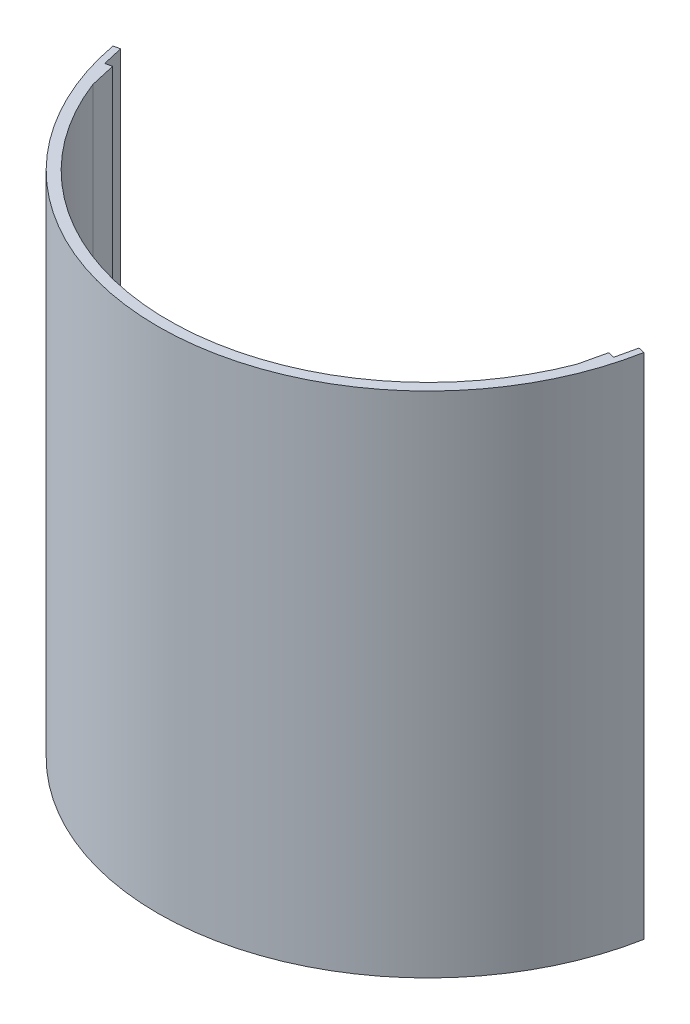
ISO-10303-21;
HEADER;
FILE_DESCRIPTION(('STEP AP214'),'2;1');
FILE_NAME('part.step','',(''),(''),'','','');
FILE_SCHEMA(('AUTOMOTIVE_DESIGN { 1 0 10303 214 1 1 1 1 }'));
ENDSEC;
DATA;
#1=APPLICATION_CONTEXT('core data for automotive mechanical design processes');
#2=APPLICATION_PROTOCOL_DEFINITION('international standard','automotive_design',2000,#1);
#3=PRODUCT_CONTEXT('',#1,'mechanical');
#4=PRODUCT('Part','Part','',(#3));
#5=PRODUCT_RELATED_PRODUCT_CATEGORY('part','',(#4));
#6=PRODUCT_DEFINITION_FORMATION('','',#4);
#7=PRODUCT_DEFINITION_CONTEXT('part definition',#1,'design');
#8=PRODUCT_DEFINITION('design','',#6,#7);
#9=PRODUCT_DEFINITION_SHAPE('','',#8);
#10=(LENGTH_UNIT() NAMED_UNIT(*) SI_UNIT(.MILLI.,.METRE.));
#11=(NAMED_UNIT(*) PLANE_ANGLE_UNIT() SI_UNIT($,.RADIAN.));
#12=(NAMED_UNIT(*) SI_UNIT($,.STERADIAN.) SOLID_ANGLE_UNIT());
#13=UNCERTAINTY_MEASURE_WITH_UNIT(LENGTH_MEASURE(1.E-05),#10,'distance_accuracy_value','');
#14=(GEOMETRIC_REPRESENTATION_CONTEXT(3) GLOBAL_UNCERTAINTY_ASSIGNED_CONTEXT((#13)) GLOBAL_UNIT_ASSIGNED_CONTEXT((#10,
#11,#12)) REPRESENTATION_CONTEXT('',''));
#15=CARTESIAN_POINT('',(0.,0.,0.));
#16=DIRECTION('',(0.,0.,1.));
#17=DIRECTION('',(1.,0.,0.));
#18=AXIS2_PLACEMENT_3D('',#15,#16,#17);
#19=CARTESIAN_POINT('',(-46.8430902791342,204.663469235024,12.7269357309953));
#20=DIRECTION('',(-0.975000000000001,0.,0.222204860432888));
#21=DIRECTION('',(0.222204860432888,0.,0.975000000000001));
#22=AXIS2_PLACEMENT_3D('',#19,#20,#21);
#23=PLANE('',#22);
#24=DIRECTION('',(-0.222204860432888,0.,-0.975000000000001));
#25=VECTOR('',#24,1.);
#26=CARTESIAN_POINT('',(-46.8430902791342,96.,12.7269357309953));
#27=LINE('',#26,#25);
#28=CARTESIAN_POINT('',(-45.7360389950115,96.,17.5845027523325));
#29=VERTEX_POINT('',#28);
#30=CARTESIAN_POINT('',(-46.8430902791342,96.,12.7269357309953));
#31=VERTEX_POINT('',#30);
#32=EDGE_CURVE('E169',#29,#31,#27,.T.);
#33=ORIENTED_EDGE('',*,*,#32,.F.);
#34=DIRECTION('',(0.,-1.,0.));
#35=VECTOR('',#34,1.);
#36=CARTESIAN_POINT('',(-45.7360389950115,204.663469235024,17.5845027523325));
#37=LINE('',#36,#35);
#38=CARTESIAN_POINT('',(-45.7360389950115,0.,17.5845027523325));
#39=VERTEX_POINT('',#38);
#40=EDGE_CURVE('E47',#29,#39,#37,.T.);
#41=ORIENTED_EDGE('',*,*,#40,.T.);
#42=DIRECTION('',(-0.222204860432888,0.,-0.975));
#43=VECTOR('',#42,1.);
#44=CARTESIAN_POINT('',(-46.8430902791342,0.,12.7269357309953));
#45=LINE('',#44,#43);
#46=CARTESIAN_POINT('',(-46.8430902791342,0.,12.7269357309953));
#47=VERTEX_POINT('',#46);
#48=EDGE_CURVE('E180',#39,#47,#45,.T.);
#49=ORIENTED_EDGE('',*,*,#48,.T.);
#50=DIRECTION('',(0.,-1.,0.));
#51=VECTOR('',#50,1.);
#52=CARTESIAN_POINT('',(-46.8430902791342,204.663469235024,12.7269357309953));
#53=LINE('',#52,#51);
#54=EDGE_CURVE('E107',#31,#47,#53,.T.);
#55=ORIENTED_EDGE('',*,*,#54,.F.);
#56=EDGE_LOOP('',(#33,#41,#49,#55));
#57=FACE_BOUND('',#56,.T.);
#58=ADVANCED_FACE('F43',(#57),#23,.F.);
#59=CARTESIAN_POINT('',(-46.8430902791342,204.663469235024,12.7269357309953));
#60=DIRECTION('',(0.222204860432887,0.,0.975000000000001));
#61=DIRECTION('',(0.975000000000001,0.,-0.222204860432887));
#62=AXIS2_PLACEMENT_3D('',#59,#60,#61);
#63=PLANE('',#62);
#64=DIRECTION('',(-0.975000000000001,0.,0.222204860432887));
#65=VECTOR('',#64,1.);
#66=CARTESIAN_POINT('',(-46.8430902791342,96.,12.7269357309953));
#67=LINE('',#66,#65);
#68=CARTESIAN_POINT('',(-48.0618402791341,96.,13.0046918065364));
#69=VERTEX_POINT('',#68);
#70=EDGE_CURVE('E114',#31,#69,#67,.T.);
#71=ORIENTED_EDGE('',*,*,#70,.F.);
#72=ORIENTED_EDGE('',*,*,#54,.T.);
#73=DIRECTION('',(-0.975,0.,0.222204860432887));
#74=VECTOR('',#73,1.);
#75=CARTESIAN_POINT('',(-46.8430902791342,0.,12.7269357309953));
#76=LINE('',#75,#74);
#77=CARTESIAN_POINT('',(-48.0618402791341,0.,13.0046918065364));
#78=VERTEX_POINT('',#77);
#79=EDGE_CURVE('E179',#47,#78,#76,.T.);
#80=ORIENTED_EDGE('',*,*,#79,.T.);
#81=DIRECTION('',(0.,-1.,0.));
#82=VECTOR('',#81,1.);
#83=CARTESIAN_POINT('',(-48.0618402791341,204.663469235024,13.0046918065364));
#84=LINE('',#83,#82);
#85=EDGE_CURVE('E181',#69,#78,#84,.T.);
#86=ORIENTED_EDGE('',*,*,#85,.F.);
#87=EDGE_LOOP('',(#71,#72,#80,#86));
#88=FACE_BOUND('',#87,.T.);
#89=ADVANCED_FACE('F238',(#88),#63,.F.);
#90=CARTESIAN_POINT('',(-48.0618402791341,204.663469235024,13.0046918065364));
#91=DIRECTION('',(-0.974999999999997,0.,0.222204860432904));
#92=DIRECTION('',(0.222204860432904,0.,0.974999999999997));
#93=AXIS2_PLACEMENT_3D('',#90,#91,#92);
#94=PLANE('',#93);
#95=DIRECTION('',(-0.222204860432904,0.,-0.974999999999997));
#96=VECTOR('',#95,1.);
#97=CARTESIAN_POINT('',(-48.0618402791341,96.,13.0046918065364));
#98=LINE('',#97,#96);
#99=CARTESIAN_POINT('',(-48.9506597208657,96.,9.10469180653663));
#100=VERTEX_POINT('',#99);
#101=EDGE_CURVE('E163',#69,#100,#98,.T.);
#102=ORIENTED_EDGE('',*,*,#101,.F.);
#103=ORIENTED_EDGE('',*,*,#85,.T.);
#104=DIRECTION('',(-0.222204860432904,0.,-0.974999999999997));
#105=VECTOR('',#104,1.);
#106=CARTESIAN_POINT('',(-48.0618402791341,0.,13.0046918065364));
#107=LINE('',#106,#105);
#108=CARTESIAN_POINT('',(-48.9506597208657,0.,9.10469180653663));
#109=VERTEX_POINT('',#108);
#110=EDGE_CURVE('E184',#78,#109,#107,.T.);
#111=ORIENTED_EDGE('',*,*,#110,.T.);
#112=DIRECTION('',(0.,-1.,0.));
#113=VECTOR('',#112,1.);
#114=CARTESIAN_POINT('',(-48.9506597208657,204.663469235024,9.10469180653663));
#115=LINE('',#114,#113);
#116=EDGE_CURVE('E185',#100,#109,#115,.T.);
#117=ORIENTED_EDGE('',*,*,#116,.F.);
#118=EDGE_LOOP('',(#102,#103,#111,#117));
#119=FACE_BOUND('',#118,.T.);
#120=ADVANCED_FACE('F241',(#119),#94,.F.);
#121=CARTESIAN_POINT('',(-48.9506597208657,204.663469235024,9.10469180653663));
#122=DIRECTION('',(0.22220486043289,0.,0.975));
#123=DIRECTION('',(0.975,0.,-0.22220486043289));
#124=AXIS2_PLACEMENT_3D('',#121,#122,#123);
#125=PLANE('',#124);
#126=DIRECTION('',(-0.975,0.,0.22220486043289));
#127=VECTOR('',#126,1.);
#128=CARTESIAN_POINT('',(-48.9506597208657,96.,9.10469180653663));
#129=LINE('',#128,#127);
#130=CARTESIAN_POINT('',(-50.1311597152052,96.,9.37373061318611));
#131=VERTEX_POINT('',#130);
#132=EDGE_CURVE('E159',#100,#131,#129,.T.);
#133=ORIENTED_EDGE('',*,*,#132,.F.);
#134=ORIENTED_EDGE('',*,*,#116,.T.);
#135=DIRECTION('',(-0.975,0.,0.22220486043289));
#136=VECTOR('',#135,1.);
#137=CARTESIAN_POINT('',(-48.9506597208657,0.,9.10469180653663));
#138=LINE('',#137,#136);
#139=CARTESIAN_POINT('',(-50.1311597152052,0.,9.37373061318611));
#140=VERTEX_POINT('',#139);
#141=EDGE_CURVE('E188',#109,#140,#138,.T.);
#142=ORIENTED_EDGE('',*,*,#141,.T.);
#143=DIRECTION('',(0.,-1.,0.));
#144=VECTOR('',#143,1.);
#145=CARTESIAN_POINT('',(-50.1311597152052,204.663469235024,9.37373061318611));
#146=LINE('',#145,#144);
#147=EDGE_CURVE('E189',#131,#140,#146,.T.);
#148=ORIENTED_EDGE('',*,*,#147,.F.);
#149=EDGE_LOOP('',(#133,#134,#142,#148));
#150=FACE_BOUND('',#149,.T.);
#151=ADVANCED_FACE('F243',(#150),#125,.F.);
#152=CARTESIAN_POINT('',(0.,204.663469235024,0.));
#153=DIRECTION('',(0.,-1.,0.));
#154=DIRECTION('',(0.,0.,-1.));
#155=AXIS2_PLACEMENT_3D('',#152,#153,#154);
#156=CYLINDRICAL_SURFACE('',#155,51.);
#157=CARTESIAN_POINT('',(0.,96.,0.));
#158=DIRECTION('',(0.,1.,0.));
#159=DIRECTION('',(0.,0.,1.));
#160=AXIS2_PLACEMENT_3D('',#157,#158,#159);
#161=CIRCLE('',#160,51.);
#162=CARTESIAN_POINT('',(50.1311597152053,96.,9.37373061318569));
#163=VERTEX_POINT('',#162);
#164=EDGE_CURVE('E155',#131,#163,#161,.T.);
#165=ORIENTED_EDGE('',*,*,#164,.F.);
#166=ORIENTED_EDGE('',*,*,#147,.T.);
#167=CARTESIAN_POINT('',(0.,0.,0.));
#168=DIRECTION('',(0.,1.,0.));
#169=DIRECTION('',(0.,0.,1.));
#170=AXIS2_PLACEMENT_3D('',#167,#168,#169);
#171=CIRCLE('',#170,51.);
#172=CARTESIAN_POINT('',(50.1311597152053,0.,9.37373061318569));
#173=VERTEX_POINT('',#172);
#174=EDGE_CURVE('E192',#140,#173,#171,.T.);
#175=ORIENTED_EDGE('',*,*,#174,.T.);
#176=DIRECTION('',(0.,-1.,0.));
#177=VECTOR('',#176,1.);
#178=CARTESIAN_POINT('',(50.1311597152053,204.663469235024,9.37373061318569));
#179=LINE('',#178,#177);
#180=EDGE_CURVE('E193',#163,#173,#179,.T.);
#181=ORIENTED_EDGE('',*,*,#180,.F.);
#182=EDGE_LOOP('',(#165,#166,#175,#181));
#183=FACE_BOUND('',#182,.T.);
#184=ADVANCED_FACE('F247',(#183),#156,.T.);
#185=CARTESIAN_POINT('',(48.9506597208658,204.663469235024,9.10469180653618));
#186=DIRECTION('',(-0.222204860432891,0.,0.975));
#187=DIRECTION('',(0.975,0.,0.222204860432891));
#188=AXIS2_PLACEMENT_3D('',#185,#186,#187);
#189=PLANE('',#188);
#190=DIRECTION('',(-0.975,0.,-0.222204860432891));
#191=VECTOR('',#190,1.);
#192=CARTESIAN_POINT('',(48.9506597208658,96.,9.10469180653618));
#193=LINE('',#192,#191);
#194=CARTESIAN_POINT('',(48.9506597208658,96.,9.10469180653618));
#195=VERTEX_POINT('',#194);
#196=EDGE_CURVE('E149',#163,#195,#193,.T.);
#197=ORIENTED_EDGE('',*,*,#196,.F.);
#198=ORIENTED_EDGE('',*,*,#180,.T.);
#199=DIRECTION('',(-0.975,0.,-0.222204860432891));
#200=VECTOR('',#199,1.);
#201=CARTESIAN_POINT('',(48.9506597208658,0.,9.10469180653618));
#202=LINE('',#201,#200);
#203=CARTESIAN_POINT('',(48.9506597208658,0.,9.10469180653618));
#204=VERTEX_POINT('',#203);
#205=EDGE_CURVE('E196',#173,#204,#202,.T.);
#206=ORIENTED_EDGE('',*,*,#205,.T.);
#207=DIRECTION('',(0.,-1.,0.));
#208=VECTOR('',#207,1.);
#209=CARTESIAN_POINT('',(48.9506597208658,204.663469235024,9.10469180653618));
#210=LINE('',#209,#208);
#211=EDGE_CURVE('E197',#195,#204,#210,.T.);
#212=ORIENTED_EDGE('',*,*,#211,.F.);
#213=EDGE_LOOP('',(#197,#198,#206,#212));
#214=FACE_BOUND('',#213,.T.);
#215=ADVANCED_FACE('F252',(#214),#189,.F.);
#216=CARTESIAN_POINT('',(48.0618402791342,204.663469235024,13.0046918065362));
#217=DIRECTION('',(0.975,0.,0.222204860432888));
#218=DIRECTION('',(0.222204860432889,0.,-0.975));
#219=AXIS2_PLACEMENT_3D('',#216,#217,#218);
#220=PLANE('',#219);
#221=DIRECTION('',(-0.222204860432889,0.,0.975));
#222=VECTOR('',#221,1.);
#223=CARTESIAN_POINT('',(48.0618402791342,96.,13.0046918065362));
#224=LINE('',#223,#222);
#225=CARTESIAN_POINT('',(48.0618402791342,96.,13.0046918065362));
#226=VERTEX_POINT('',#225);
#227=EDGE_CURVE('E145',#195,#226,#224,.T.);
#228=ORIENTED_EDGE('',*,*,#227,.F.);
#229=ORIENTED_EDGE('',*,*,#211,.T.);
#230=DIRECTION('',(-0.222204860432889,0.,0.975));
#231=VECTOR('',#230,1.);
#232=CARTESIAN_POINT('',(48.0618402791342,0.,13.0046918065362));
#233=LINE('',#232,#231);
#234=CARTESIAN_POINT('',(48.0618402791342,0.,13.0046918065362));
#235=VERTEX_POINT('',#234);
#236=EDGE_CURVE('E200',#204,#235,#233,.T.);
#237=ORIENTED_EDGE('',*,*,#236,.T.);
#238=DIRECTION('',(0.,-1.,0.));
#239=VECTOR('',#238,1.);
#240=CARTESIAN_POINT('',(48.0618402791342,204.663469235024,13.0046918065362));
#241=LINE('',#240,#239);
#242=EDGE_CURVE('E201',#226,#235,#241,.T.);
#243=ORIENTED_EDGE('',*,*,#242,.F.);
#244=EDGE_LOOP('',(#228,#229,#237,#243));
#245=FACE_BOUND('',#244,.T.);
#246=ADVANCED_FACE('F255',(#245),#220,.F.);
#247=CARTESIAN_POINT('',(46.8430902791342,204.663469235024,12.7269357309951));
#248=DIRECTION('',(-0.222204860432889,0.,0.975));
#249=DIRECTION('',(0.975,0.,0.222204860432889));
#250=AXIS2_PLACEMENT_3D('',#247,#248,#249);
#251=PLANE('',#250);
#252=DIRECTION('',(-0.975,0.,-0.222204860432889));
#253=VECTOR('',#252,1.);
#254=CARTESIAN_POINT('',(46.8430902791342,96.,12.7269357309951));
#255=LINE('',#254,#253);
#256=CARTESIAN_POINT('',(46.8430902791342,96.,12.7269357309951));
#257=VERTEX_POINT('',#256);
#258=EDGE_CURVE('E53',#226,#257,#255,.T.);
#259=ORIENTED_EDGE('',*,*,#258,.F.);
#260=ORIENTED_EDGE('',*,*,#242,.T.);
#261=DIRECTION('',(-0.975,0.,-0.222204860432889));
#262=VECTOR('',#261,1.);
#263=CARTESIAN_POINT('',(46.8430902791342,0.,12.7269357309951));
#264=LINE('',#263,#262);
#265=CARTESIAN_POINT('',(46.8430902791342,0.,12.7269357309951));
#266=VERTEX_POINT('',#265);
#267=EDGE_CURVE('E138',#235,#266,#264,.T.);
#268=ORIENTED_EDGE('',*,*,#267,.T.);
#269=DIRECTION('',(0.,-1.,0.));
#270=VECTOR('',#269,1.);
#271=CARTESIAN_POINT('',(46.8430902791342,204.663469235024,12.7269357309951));
#272=LINE('',#271,#270);
#273=EDGE_CURVE('E129',#257,#266,#272,.T.);
#274=ORIENTED_EDGE('',*,*,#273,.F.);
#275=EDGE_LOOP('',(#259,#260,#268,#274));
#276=FACE_BOUND('',#275,.T.);
#277=ADVANCED_FACE('F135',(#276),#251,.F.);
#278=CARTESIAN_POINT('',(46.8430902791342,204.663469235024,12.7269357309951));
#279=DIRECTION('',(0.975,0.,0.222204860432889));
#280=DIRECTION('',(0.222204860432889,0.,-0.975));
#281=AXIS2_PLACEMENT_3D('',#278,#279,#280);
#282=PLANE('',#281);
#283=DIRECTION('',(-0.222204860432889,0.,0.975));
#284=VECTOR('',#283,1.);
#285=CARTESIAN_POINT('',(46.8430902791342,96.,12.7269357309951));
#286=LINE('',#285,#284);
#287=CARTESIAN_POINT('',(45.7360389950115,96.,17.5845027523325));
#288=VERTEX_POINT('',#287);
#289=EDGE_CURVE('E11',#257,#288,#286,.T.);
#290=ORIENTED_EDGE('',*,*,#289,.F.);
#291=ORIENTED_EDGE('',*,*,#273,.T.);
#292=DIRECTION('',(-0.222204860432889,0.,0.975));
#293=VECTOR('',#292,1.);
#294=CARTESIAN_POINT('',(46.8430902791342,0.,12.7269357309951));
#295=LINE('',#294,#293);
#296=CARTESIAN_POINT('',(45.7360389950115,0.,17.5845027523325));
#297=VERTEX_POINT('',#296);
#298=EDGE_CURVE('E141',#266,#297,#295,.T.);
#299=ORIENTED_EDGE('',*,*,#298,.T.);
#300=DIRECTION('',(0.,-1.,0.));
#301=VECTOR('',#300,1.);
#302=CARTESIAN_POINT('',(45.7360389950115,204.663469235024,17.5845027523325));
#303=LINE('',#302,#301);
#304=EDGE_CURVE('E66',#288,#297,#303,.T.);
#305=ORIENTED_EDGE('',*,*,#304,.F.);
#306=EDGE_LOOP('',(#290,#291,#299,#305));
#307=FACE_BOUND('',#306,.T.);
#308=ADVANCED_FACE('F128',(#307),#282,.F.);
#309=CARTESIAN_POINT('',(0.,204.663469235024,0.));
#310=DIRECTION('',(0.,-1.,0.));
#311=DIRECTION('',(0.,0.,-1.));
#312=AXIS2_PLACEMENT_3D('',#309,#310,#311);
#313=CYLINDRICAL_SURFACE('',#312,49.);
#314=CARTESIAN_POINT('',(0.,96.,0.));
#315=DIRECTION('',(0.,1.,0.));
#316=DIRECTION('',(0.,0.,1.));
#317=AXIS2_PLACEMENT_3D('',#314,#315,#316);
#318=CIRCLE('',#317,49.);
#319=EDGE_CURVE('E173',#288,#29,#318,.F.);
#320=ORIENTED_EDGE('',*,*,#319,.F.);
#321=ORIENTED_EDGE('',*,*,#304,.T.);
#322=CARTESIAN_POINT('',(0.,0.,0.));
#323=DIRECTION('',(0.,-1.,0.));
#324=DIRECTION('',(0.,0.,1.));
#325=AXIS2_PLACEMENT_3D('',#322,#323,#324);
#326=CIRCLE('',#325,49.);
#327=EDGE_CURVE('E176',#297,#39,#326,.T.);
#328=ORIENTED_EDGE('',*,*,#327,.T.);
#329=ORIENTED_EDGE('',*,*,#40,.F.);
#330=EDGE_LOOP('',(#320,#321,#328,#329));
#331=FACE_BOUND('',#330,.T.);
#332=ADVANCED_FACE('F233',(#331),#313,.F.);
#333=CARTESIAN_POINT('',(0.,0.,0.));
#334=DIRECTION('',(0.,1.,0.));
#335=DIRECTION('',(0.,0.,1.));
#336=AXIS2_PLACEMENT_3D('',#333,#334,#335);
#337=PLANE('',#336);
#338=ORIENTED_EDGE('',*,*,#48,.F.);
#339=ORIENTED_EDGE('',*,*,#327,.F.);
#340=ORIENTED_EDGE('',*,*,#298,.F.);
#341=ORIENTED_EDGE('',*,*,#267,.F.);
#342=ORIENTED_EDGE('',*,*,#236,.F.);
#343=ORIENTED_EDGE('',*,*,#205,.F.);
#344=ORIENTED_EDGE('',*,*,#174,.F.);
#345=ORIENTED_EDGE('',*,*,#141,.F.);
#346=ORIENTED_EDGE('',*,*,#110,.F.);
#347=ORIENTED_EDGE('',*,*,#79,.F.);
#348=EDGE_LOOP('',(#338,#339,#340,#341,#342,#343,#344,#345,#346,#347));
#349=FACE_BOUND('',#348,.T.);
#350=ADVANCED_FACE('F235',(#349),#337,.F.);
#351=CARTESIAN_POINT('',(0.,96.,0.));
#352=DIRECTION('',(0.,1.,0.));
#353=DIRECTION('',(0.,0.,1.));
#354=AXIS2_PLACEMENT_3D('',#351,#352,#353);
#355=PLANE('',#354);
#356=ORIENTED_EDGE('',*,*,#319,.T.);
#357=ORIENTED_EDGE('',*,*,#32,.T.);
#358=ORIENTED_EDGE('',*,*,#70,.T.);
#359=ORIENTED_EDGE('',*,*,#101,.T.);
#360=ORIENTED_EDGE('',*,*,#132,.T.);
#361=ORIENTED_EDGE('',*,*,#164,.T.);
#362=ORIENTED_EDGE('',*,*,#196,.T.);
#363=ORIENTED_EDGE('',*,*,#227,.T.);
#364=ORIENTED_EDGE('',*,*,#258,.T.);
#365=ORIENTED_EDGE('',*,*,#289,.T.);
#366=EDGE_LOOP('',(#356,#357,#358,#359,#360,#361,#362,#363,#364,#365));
#367=FACE_BOUND('',#366,.T.);
#368=ADVANCED_FACE('F45',(#367),#355,.T.);
#369=CLOSED_SHELL('',(#58,#89,#120,#151,#184,#215,#246,#277,#308,#332,#350,#368));
#370=MANIFOLD_SOLID_BREP('B2',#369);
#371=ADVANCED_BREP_SHAPE_REPRESENTATION('',(#18,#370),#14);
#372=SHAPE_DEFINITION_REPRESENTATION(#9,#371);
ENDSEC;
END-ISO-10303-21;
